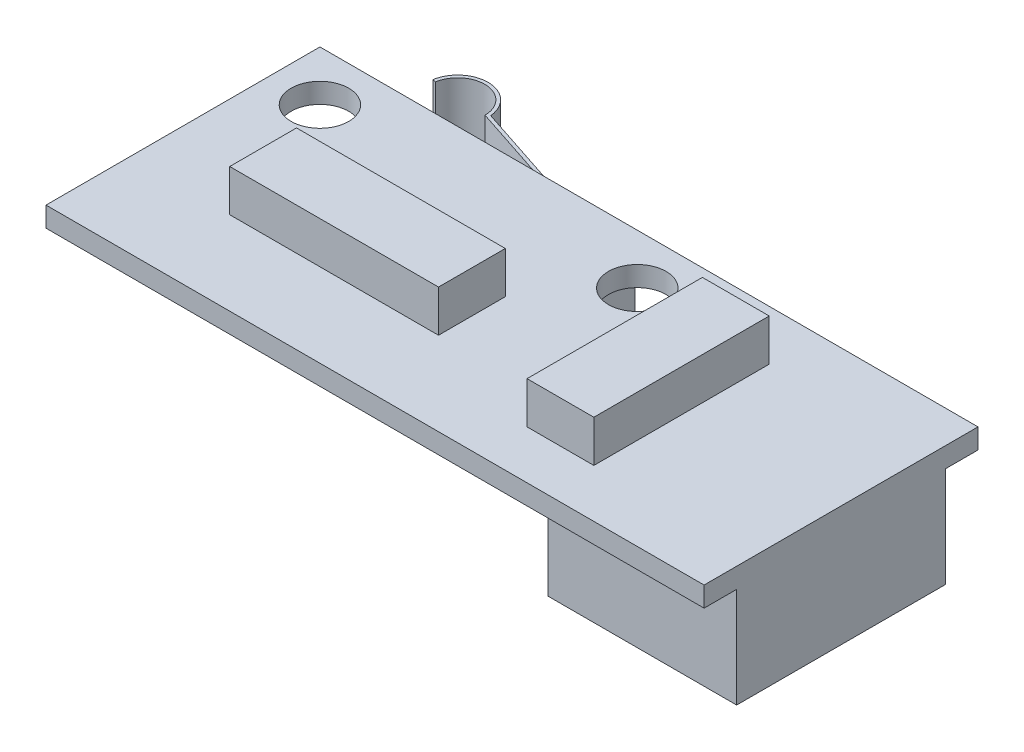
ISO-10303-21;
HEADER;
FILE_DESCRIPTION(('STEP AP214'),'2;1');
FILE_NAME('part.step','',(''),(''),'','','');
FILE_SCHEMA(('AUTOMOTIVE_DESIGN { 1 0 10303 214 1 1 1 1 }'));
ENDSEC;
DATA;
#1=APPLICATION_CONTEXT('core data for automotive mechanical design processes');
#2=APPLICATION_PROTOCOL_DEFINITION('international standard','automotive_design',2000,#1);
#3=PRODUCT_CONTEXT('',#1,'mechanical');
#4=PRODUCT('Part','Part','',(#3));
#5=PRODUCT_RELATED_PRODUCT_CATEGORY('part','',(#4));
#6=PRODUCT_DEFINITION_FORMATION('','',#4);
#7=PRODUCT_DEFINITION_CONTEXT('part definition',#1,'design');
#8=PRODUCT_DEFINITION('design','',#6,#7);
#9=PRODUCT_DEFINITION_SHAPE('','',#8);
#10=(LENGTH_UNIT() NAMED_UNIT(*) SI_UNIT(.MILLI.,.METRE.));
#11=(NAMED_UNIT(*) PLANE_ANGLE_UNIT() SI_UNIT($,.RADIAN.));
#12=(NAMED_UNIT(*) SI_UNIT($,.STERADIAN.) SOLID_ANGLE_UNIT());
#13=UNCERTAINTY_MEASURE_WITH_UNIT(LENGTH_MEASURE(1.E-05),#10,'distance_accuracy_value','');
#14=(GEOMETRIC_REPRESENTATION_CONTEXT(3) GLOBAL_UNCERTAINTY_ASSIGNED_CONTEXT((#13)) GLOBAL_UNIT_ASSIGNED_CONTEXT((#10,
#11,#12)) REPRESENTATION_CONTEXT('',''));
#15=CARTESIAN_POINT('',(0.,0.,0.));
#16=DIRECTION('',(0.,0.,1.));
#17=DIRECTION('',(1.,0.,0.));
#18=AXIS2_PLACEMENT_3D('',#15,#16,#17);
#19=CARTESIAN_POINT('',(19.7,1.2,-8.2));
#20=DIRECTION('',(0.,0.,1.));
#21=DIRECTION('',(1.,0.,0.));
#22=AXIS2_PLACEMENT_3D('',#19,#20,#21);
#23=PLANE('',#22);
#24=DIRECTION('',(-1.,0.,0.));
#25=VECTOR('',#24,1.);
#26=CARTESIAN_POINT('',(19.7,0.,-8.2));
#27=LINE('',#26,#25);
#28=CARTESIAN_POINT('',(19.7,0.,-8.2));
#29=VERTEX_POINT('',#28);
#30=CARTESIAN_POINT('',(-0.825000000000005,0.,-8.2));
#31=VERTEX_POINT('',#30);
#32=EDGE_CURVE('E361',#29,#31,#27,.T.);
#33=ORIENTED_EDGE('',*,*,#32,.T.);
#34=DIRECTION('',(0.,1.,0.));
#35=VECTOR('',#34,1.);
#36=CARTESIAN_POINT('',(-0.825000000000005,-6.,-8.2));
#37=LINE('',#36,#35);
#38=CARTESIAN_POINT('',(-0.825000000000005,-6.,-8.2));
#39=VERTEX_POINT('',#38);
#40=EDGE_CURVE('E252',#39,#31,#37,.T.);
#41=ORIENTED_EDGE('',*,*,#40,.F.);
#42=DIRECTION('',(1.,0.,0.));
#43=VECTOR('',#42,1.);
#44=CARTESIAN_POINT('',(-13.575,-6.,-8.2));
#45=LINE('',#44,#43);
#46=CARTESIAN_POINT('',(-13.575,-6.,-8.2));
#47=VERTEX_POINT('',#46);
#48=EDGE_CURVE('E238',#47,#39,#45,.T.);
#49=ORIENTED_EDGE('',*,*,#48,.F.);
#50=DIRECTION('',(0.,1.,0.));
#51=VECTOR('',#50,1.);
#52=CARTESIAN_POINT('',(-13.575,-6.,-8.2));
#53=LINE('',#52,#51);
#54=CARTESIAN_POINT('',(-13.575,0.,-8.2));
#55=VERTEX_POINT('',#54);
#56=EDGE_CURVE('E254',#47,#55,#53,.T.);
#57=ORIENTED_EDGE('',*,*,#56,.T.);
#58=CARTESIAN_POINT('',(-19.7,0.,-8.2));
#59=VERTEX_POINT('',#58);
#60=EDGE_CURVE('E376',#55,#59,#27,.T.);
#61=ORIENTED_EDGE('',*,*,#60,.T.);
#62=DIRECTION('',(0.,-1.,0.));
#63=VECTOR('',#62,1.);
#64=CARTESIAN_POINT('',(-19.7,1.2,-8.2));
#65=LINE('',#64,#63);
#66=CARTESIAN_POINT('',(-19.7,1.2,-8.2));
#67=VERTEX_POINT('',#66);
#68=EDGE_CURVE('E367',#67,#59,#65,.T.);
#69=ORIENTED_EDGE('',*,*,#68,.F.);
#70=DIRECTION('',(-1.,0.,0.));
#71=VECTOR('',#70,1.);
#72=CARTESIAN_POINT('',(19.7,1.2,-8.2));
#73=LINE('',#72,#71);
#74=CARTESIAN_POINT('',(19.7,1.2,-8.2));
#75=VERTEX_POINT('',#74);
#76=EDGE_CURVE('E365',#75,#67,#73,.T.);
#77=ORIENTED_EDGE('',*,*,#76,.F.);
#78=DIRECTION('',(0.,-1.,0.));
#79=VECTOR('',#78,1.);
#80=CARTESIAN_POINT('',(19.7,1.2,-8.2));
#81=LINE('',#80,#79);
#82=EDGE_CURVE('E381',#75,#29,#81,.T.);
#83=ORIENTED_EDGE('',*,*,#82,.T.);
#84=EDGE_LOOP('',(#33,#41,#49,#57,#61,#69,#77,#83));
#85=FACE_BOUND('',#84,.T.);
#86=DIRECTION('',(-1.,0.,0.));
#87=VECTOR('',#86,1.);
#88=CARTESIAN_POINT('',(-1.825,-5.,-8.2));
#89=LINE('',#88,#87);
#90=CARTESIAN_POINT('',(-1.825,-5.,-8.2));
#91=VERTEX_POINT('',#90);
#92=CARTESIAN_POINT('',(-2.465,-5.,-8.2));
#93=VERTEX_POINT('',#92);
#94=EDGE_CURVE('E214',#91,#93,#89,.T.);
#95=ORIENTED_EDGE('',*,*,#94,.F.);
#96=DIRECTION('',(0.,1.,0.));
#97=VECTOR('',#96,1.);
#98=CARTESIAN_POINT('',(-1.825,-5.,-8.2));
#99=LINE('',#98,#97);
#100=CARTESIAN_POINT('',(-1.825,-1.,-8.2));
#101=VERTEX_POINT('',#100);
#102=EDGE_CURVE('E627',#91,#101,#99,.T.);
#103=ORIENTED_EDGE('',*,*,#102,.T.);
#104=DIRECTION('',(-1.,0.,0.));
#105=VECTOR('',#104,1.);
#106=CARTESIAN_POINT('',(-1.825,-1.,-8.2));
#107=LINE('',#106,#105);
#108=CARTESIAN_POINT('',(-2.465,-1.,-8.2));
#109=VERTEX_POINT('',#108);
#110=EDGE_CURVE('E227',#101,#109,#107,.T.);
#111=ORIENTED_EDGE('',*,*,#110,.T.);
#112=DIRECTION('',(0.,1.,0.));
#113=VECTOR('',#112,1.);
#114=CARTESIAN_POINT('',(-2.465,-5.,-8.2));
#115=LINE('',#114,#113);
#116=EDGE_CURVE('E48',#93,#109,#115,.T.);
#117=ORIENTED_EDGE('',*,*,#116,.F.);
#118=EDGE_LOOP('',(#95,#103,#111,#117));
#119=FACE_BOUND('',#118,.T.);
#120=ADVANCED_FACE('F33',(#85,#119),#23,.F.);
#121=CARTESIAN_POINT('',(0.,0.,0.));
#122=DIRECTION('',(0.,1.,0.));
#123=DIRECTION('',(0.,0.,1.));
#124=AXIS2_PLACEMENT_3D('',#121,#122,#123);
#125=PLANE('',#124);
#126=CARTESIAN_POINT('',(-16.7,0.,-5.19999999999999));
#127=DIRECTION('',(0.,1.,0.));
#128=DIRECTION('',(0.,0.,1.));
#129=AXIS2_PLACEMENT_3D('',#126,#127,#128);
#130=CIRCLE('',#129,1.725);
#131=CARTESIAN_POINT('',(-16.7,0.,-3.47499999999999));
#132=VERTEX_POINT('',#131);
#133=EDGE_CURVE('E348',#132,#132,#130,.T.);
#134=ORIENTED_EDGE('',*,*,#133,.T.);
#135=EDGE_LOOP('',(#134));
#136=FACE_BOUND('',#135,.T.);
#137=CARTESIAN_POINT('',(2.29999999999999,0.,-5.19999999999999));
#138=DIRECTION('',(0.,1.,0.));
#139=DIRECTION('',(0.,0.,1.));
#140=AXIS2_PLACEMENT_3D('',#137,#138,#139);
#141=CIRCLE('',#140,1.725);
#142=CARTESIAN_POINT('',(2.29999999999999,0.,-3.47499999999999));
#143=VERTEX_POINT('',#142);
#144=EDGE_CURVE('E344',#143,#143,#141,.T.);
#145=ORIENTED_EDGE('',*,*,#144,.T.);
#146=EDGE_LOOP('',(#145));
#147=FACE_BOUND('',#146,.T.);
#148=DIRECTION('',(0.,0.,-1.));
#149=VECTOR('',#148,1.);
#150=CARTESIAN_POINT('',(-13.575,0.,-8.2));
#151=LINE('',#150,#149);
#152=CARTESIAN_POINT('',(-13.575,0.,-1.6));
#153=VERTEX_POINT('',#152);
#154=EDGE_CURVE('E56',#153,#55,#151,.T.);
#155=ORIENTED_EDGE('',*,*,#154,.F.);
#156=DIRECTION('',(-1.,0.,0.));
#157=VECTOR('',#156,1.);
#158=CARTESIAN_POINT('',(-13.575,0.,-1.6));
#159=LINE('',#158,#157);
#160=CARTESIAN_POINT('',(-0.825000000000004,0.,-1.6));
#161=VERTEX_POINT('',#160);
#162=EDGE_CURVE('E239',#161,#153,#159,.T.);
#163=ORIENTED_EDGE('',*,*,#162,.F.);
#164=DIRECTION('',(0.,0.,1.));
#165=VECTOR('',#164,1.);
#166=CARTESIAN_POINT('',(-0.825000000000005,0.,-8.2));
#167=LINE('',#166,#165);
#168=EDGE_CURVE('E229',#31,#161,#167,.T.);
#169=ORIENTED_EDGE('',*,*,#168,.F.);
#170=ORIENTED_EDGE('',*,*,#32,.F.);
#171=DIRECTION('',(0.,0.,-1.));
#172=VECTOR('',#171,1.);
#173=CARTESIAN_POINT('',(19.7,0.,8.2));
#174=LINE('',#173,#172);
#175=CARTESIAN_POINT('',(19.7,0.,-6.25));
#176=VERTEX_POINT('',#175);
#177=EDGE_CURVE('E372',#176,#29,#174,.T.);
#178=ORIENTED_EDGE('',*,*,#177,.F.);
#179=DIRECTION('',(1.,0.,0.));
#180=VECTOR('',#179,1.);
#181=CARTESIAN_POINT('',(19.7,0.,-6.25));
#182=LINE('',#181,#180);
#183=CARTESIAN_POINT('',(8.4,0.,-6.25));
#184=VERTEX_POINT('',#183);
#185=EDGE_CURVE('E261',#184,#176,#182,.T.);
#186=ORIENTED_EDGE('',*,*,#185,.F.);
#187=DIRECTION('',(0.,0.,-1.));
#188=VECTOR('',#187,1.);
#189=CARTESIAN_POINT('',(8.4,0.,6.25));
#190=LINE('',#189,#188);
#191=CARTESIAN_POINT('',(8.4,0.,6.25));
#192=VERTEX_POINT('',#191);
#193=EDGE_CURVE('E270',#192,#184,#190,.T.);
#194=ORIENTED_EDGE('',*,*,#193,.F.);
#195=DIRECTION('',(-1.,0.,0.));
#196=VECTOR('',#195,1.);
#197=CARTESIAN_POINT('',(19.7,0.,6.25));
#198=LINE('',#197,#196);
#199=CARTESIAN_POINT('',(19.7,0.,6.25));
#200=VERTEX_POINT('',#199);
#201=EDGE_CURVE('E256',#200,#192,#198,.T.);
#202=ORIENTED_EDGE('',*,*,#201,.F.);
#203=CARTESIAN_POINT('',(19.7,0.,8.2));
#204=VERTEX_POINT('',#203);
#205=EDGE_CURVE('E373',#204,#200,#174,.T.);
#206=ORIENTED_EDGE('',*,*,#205,.F.);
#207=DIRECTION('',(1.,0.,0.));
#208=VECTOR('',#207,1.);
#209=CARTESIAN_POINT('',(19.7,0.,8.2));
#210=LINE('',#209,#208);
#211=CARTESIAN_POINT('',(-19.7,0.,8.2));
#212=VERTEX_POINT('',#211);
#213=EDGE_CURVE('E370',#212,#204,#210,.T.);
#214=ORIENTED_EDGE('',*,*,#213,.F.);
#215=DIRECTION('',(0.,0.,1.));
#216=VECTOR('',#215,1.);
#217=CARTESIAN_POINT('',(-19.7,0.,8.2));
#218=LINE('',#217,#216);
#219=EDGE_CURVE('E354',#59,#212,#218,.T.);
#220=ORIENTED_EDGE('',*,*,#219,.F.);
#221=ORIENTED_EDGE('',*,*,#60,.F.);
#222=EDGE_LOOP('',(#155,#163,#169,#170,#178,#186,#194,#202,#206,#214,#220,#221));
#223=FACE_BOUND('',#222,.T.);
#224=ADVANCED_FACE('F393',(#136,#147,#223),#125,.F.);
#225=CARTESIAN_POINT('',(0.,1.2,0.));
#226=DIRECTION('',(0.,1.,0.));
#227=DIRECTION('',(0.,0.,1.));
#228=AXIS2_PLACEMENT_3D('',#225,#226,#227);
#229=PLANE('',#228);
#230=CARTESIAN_POINT('',(-16.7,1.2,-5.19999999999999));
#231=DIRECTION('',(0.,1.,0.));
#232=DIRECTION('',(0.,0.,1.));
#233=AXIS2_PLACEMENT_3D('',#230,#231,#232);
#234=CIRCLE('',#233,1.725);
#235=CARTESIAN_POINT('',(-16.7,1.2,-3.47499999999999));
#236=VERTEX_POINT('',#235);
#237=EDGE_CURVE('E351',#236,#236,#234,.T.);
#238=ORIENTED_EDGE('',*,*,#237,.F.);
#239=EDGE_LOOP('',(#238));
#240=FACE_BOUND('',#239,.T.);
#241=DIRECTION('',(0.,0.,1.));
#242=VECTOR('',#241,1.);
#243=CARTESIAN_POINT('',(-19.7,1.2,8.2));
#244=LINE('',#243,#242);
#245=CARTESIAN_POINT('',(-19.7,1.2,8.2));
#246=VERTEX_POINT('',#245);
#247=EDGE_CURVE('E357',#67,#246,#244,.T.);
#248=ORIENTED_EDGE('',*,*,#247,.T.);
#249=DIRECTION('',(1.,0.,0.));
#250=VECTOR('',#249,1.);
#251=CARTESIAN_POINT('',(19.7,1.2,8.2));
#252=LINE('',#251,#250);
#253=CARTESIAN_POINT('',(19.7,1.2,8.2));
#254=VERTEX_POINT('',#253);
#255=EDGE_CURVE('E360',#246,#254,#252,.T.);
#256=ORIENTED_EDGE('',*,*,#255,.T.);
#257=DIRECTION('',(0.,0.,-1.));
#258=VECTOR('',#257,1.);
#259=CARTESIAN_POINT('',(19.7,1.2,8.2));
#260=LINE('',#259,#258);
#261=EDGE_CURVE('E363',#254,#75,#260,.T.);
#262=ORIENTED_EDGE('',*,*,#261,.T.);
#263=ORIENTED_EDGE('',*,*,#76,.T.);
#264=EDGE_LOOP('',(#248,#256,#262,#263));
#265=FACE_BOUND('',#264,.T.);
#266=CARTESIAN_POINT('',(2.29999999999999,1.2,-5.19999999999999));
#267=DIRECTION('',(0.,1.,0.));
#268=DIRECTION('',(0.,0.,1.));
#269=AXIS2_PLACEMENT_3D('',#266,#267,#268);
#270=CIRCLE('',#269,1.725);
#271=CARTESIAN_POINT('',(2.29999999999999,1.2,-3.47499999999999));
#272=VERTEX_POINT('',#271);
#273=EDGE_CURVE('E345',#272,#272,#270,.T.);
#274=ORIENTED_EDGE('',*,*,#273,.F.);
#275=EDGE_LOOP('',(#274));
#276=FACE_BOUND('',#275,.T.);
#277=DIRECTION('',(1.,0.,0.));
#278=VECTOR('',#277,1.);
#279=CARTESIAN_POINT('',(-13.7,1.2,3.2));
#280=LINE('',#279,#278);
#281=CARTESIAN_POINT('',(-13.7,1.2,3.2));
#282=VERTEX_POINT('',#281);
#283=CARTESIAN_POINT('',(-1.2,1.2,3.2));
#284=VERTEX_POINT('',#283);
#285=EDGE_CURVE('E329',#282,#284,#280,.T.);
#286=ORIENTED_EDGE('',*,*,#285,.F.);
#287=DIRECTION('',(0.,0.,1.));
#288=VECTOR('',#287,1.);
#289=CARTESIAN_POINT('',(-13.7,1.2,-0.800000000000001));
#290=LINE('',#289,#288);
#291=CARTESIAN_POINT('',(-13.7,1.2,-0.800000000000001));
#292=VERTEX_POINT('',#291);
#293=EDGE_CURVE('E315',#292,#282,#290,.T.);
#294=ORIENTED_EDGE('',*,*,#293,.F.);
#295=DIRECTION('',(-1.,0.,0.));
#296=VECTOR('',#295,1.);
#297=CARTESIAN_POINT('',(-13.7,1.2,-0.800000000000001));
#298=LINE('',#297,#296);
#299=CARTESIAN_POINT('',(-1.2,1.2,-0.800000000000001));
#300=VERTEX_POINT('',#299);
#301=EDGE_CURVE('E320',#300,#292,#298,.T.);
#302=ORIENTED_EDGE('',*,*,#301,.F.);
#303=DIRECTION('',(0.,0.,-1.));
#304=VECTOR('',#303,1.);
#305=CARTESIAN_POINT('',(-1.2,1.2,-0.800000000000001));
#306=LINE('',#305,#304);
#307=EDGE_CURVE('E331',#284,#300,#306,.T.);
#308=ORIENTED_EDGE('',*,*,#307,.F.);
#309=EDGE_LOOP('',(#286,#294,#302,#308));
#310=FACE_BOUND('',#309,.T.);
#311=DIRECTION('',(1.,0.,0.));
#312=VECTOR('',#311,1.);
#313=CARTESIAN_POINT('',(6.2,1.2,5.3));
#314=LINE('',#313,#312);
#315=CARTESIAN_POINT('',(6.2,1.2,5.3));
#316=VERTEX_POINT('',#315);
#317=CARTESIAN_POINT('',(10.2,1.2,5.3));
#318=VERTEX_POINT('',#317);
#319=EDGE_CURVE('E300',#316,#318,#314,.T.);
#320=ORIENTED_EDGE('',*,*,#319,.F.);
#321=DIRECTION('',(0.,0.,1.));
#322=VECTOR('',#321,1.);
#323=CARTESIAN_POINT('',(6.2,1.2,-5.2));
#324=LINE('',#323,#322);
#325=CARTESIAN_POINT('',(6.2,1.2,-5.2));
#326=VERTEX_POINT('',#325);
#327=EDGE_CURVE('E286',#326,#316,#324,.T.);
#328=ORIENTED_EDGE('',*,*,#327,.F.);
#329=DIRECTION('',(-1.,0.,0.));
#330=VECTOR('',#329,1.);
#331=CARTESIAN_POINT('',(6.2,1.2,-5.2));
#332=LINE('',#331,#330);
#333=CARTESIAN_POINT('',(10.2,1.2,-5.2));
#334=VERTEX_POINT('',#333);
#335=EDGE_CURVE('E291',#334,#326,#332,.T.);
#336=ORIENTED_EDGE('',*,*,#335,.F.);
#337=DIRECTION('',(0.,0.,-1.));
#338=VECTOR('',#337,1.);
#339=CARTESIAN_POINT('',(10.2,1.2,-5.2));
#340=LINE('',#339,#338);
#341=EDGE_CURVE('E302',#318,#334,#340,.T.);
#342=ORIENTED_EDGE('',*,*,#341,.F.);
#343=EDGE_LOOP('',(#320,#328,#336,#342));
#344=FACE_BOUND('',#343,.T.);
#345=ADVANCED_FACE('F419',(#240,#265,#276,#310,#344),#229,.T.);
#346=CARTESIAN_POINT('',(-19.7,1.2,8.2));
#347=DIRECTION('',(1.,0.,0.));
#348=DIRECTION('',(0.,0.,-1.));
#349=AXIS2_PLACEMENT_3D('',#346,#347,#348);
#350=PLANE('',#349);
#351=ORIENTED_EDGE('',*,*,#219,.T.);
#352=DIRECTION('',(0.,-1.,0.));
#353=VECTOR('',#352,1.);
#354=CARTESIAN_POINT('',(-19.7,1.2,8.2));
#355=LINE('',#354,#353);
#356=EDGE_CURVE('E11',#246,#212,#355,.T.);
#357=ORIENTED_EDGE('',*,*,#356,.F.);
#358=ORIENTED_EDGE('',*,*,#247,.F.);
#359=ORIENTED_EDGE('',*,*,#68,.T.);
#360=EDGE_LOOP('',(#351,#357,#358,#359));
#361=FACE_BOUND('',#360,.T.);
#362=ADVANCED_FACE('F35',(#361),#350,.F.);
#363=CARTESIAN_POINT('',(19.7,1.2,8.2));
#364=DIRECTION('',(0.,0.,-1.));
#365=DIRECTION('',(-1.,0.,0.));
#366=AXIS2_PLACEMENT_3D('',#363,#364,#365);
#367=PLANE('',#366);
#368=ORIENTED_EDGE('',*,*,#213,.T.);
#369=DIRECTION('',(0.,-1.,0.));
#370=VECTOR('',#369,1.);
#371=CARTESIAN_POINT('',(19.7,1.2,8.2));
#372=LINE('',#371,#370);
#373=EDGE_CURVE('E41',#254,#204,#372,.T.);
#374=ORIENTED_EDGE('',*,*,#373,.F.);
#375=ORIENTED_EDGE('',*,*,#255,.F.);
#376=ORIENTED_EDGE('',*,*,#356,.T.);
#377=EDGE_LOOP('',(#368,#374,#375,#376));
#378=FACE_BOUND('',#377,.T.);
#379=ADVANCED_FACE('F422',(#378),#367,.F.);
#380=CARTESIAN_POINT('',(19.7,1.2,8.2));
#381=DIRECTION('',(-1.,0.,0.));
#382=DIRECTION('',(0.,0.,1.));
#383=AXIS2_PLACEMENT_3D('',#380,#381,#382);
#384=PLANE('',#383);
#385=ORIENTED_EDGE('',*,*,#205,.T.);
#386=DIRECTION('',(0.,1.,0.));
#387=VECTOR('',#386,1.);
#388=CARTESIAN_POINT('',(19.7,-6.,6.25));
#389=LINE('',#388,#387);
#390=CARTESIAN_POINT('',(19.7,-6.,6.25));
#391=VERTEX_POINT('',#390);
#392=EDGE_CURVE('E283',#391,#200,#389,.T.);
#393=ORIENTED_EDGE('',*,*,#392,.F.);
#394=DIRECTION('',(0.,0.,1.));
#395=VECTOR('',#394,1.);
#396=CARTESIAN_POINT('',(19.7,-6.,6.25));
#397=LINE('',#396,#395);
#398=CARTESIAN_POINT('',(19.7,-6.,-6.25));
#399=VERTEX_POINT('',#398);
#400=EDGE_CURVE('E257',#399,#391,#397,.T.);
#401=ORIENTED_EDGE('',*,*,#400,.F.);
#402=DIRECTION('',(0.,1.,0.));
#403=VECTOR('',#402,1.);
#404=CARTESIAN_POINT('',(19.7,-6.,-6.25));
#405=LINE('',#404,#403);
#406=EDGE_CURVE('E267',#399,#176,#405,.T.);
#407=ORIENTED_EDGE('',*,*,#406,.T.);
#408=ORIENTED_EDGE('',*,*,#177,.T.);
#409=ORIENTED_EDGE('',*,*,#82,.F.);
#410=ORIENTED_EDGE('',*,*,#261,.F.);
#411=ORIENTED_EDGE('',*,*,#373,.T.);
#412=EDGE_LOOP('',(#385,#393,#401,#407,#408,#409,#410,#411));
#413=FACE_BOUND('',#412,.T.);
#414=ADVANCED_FACE('F388',(#413),#384,.F.);
#415=CARTESIAN_POINT('',(-16.7,1.2,-5.19999999999999));
#416=DIRECTION('',(0.,-1.,0.));
#417=DIRECTION('',(0.,0.,-1.));
#418=AXIS2_PLACEMENT_3D('',#415,#416,#417);
#419=CYLINDRICAL_SURFACE('',#418,1.725);
#420=ORIENTED_EDGE('',*,*,#237,.T.);
#421=EDGE_LOOP('',(#420));
#422=FACE_BOUND('',#421,.T.);
#423=ORIENTED_EDGE('',*,*,#133,.F.);
#424=EDGE_LOOP('',(#423));
#425=FACE_BOUND('',#424,.T.);
#426=ADVANCED_FACE('F454',(#422,#425),#419,.F.);
#427=CARTESIAN_POINT('',(2.29999999999999,1.2,-5.19999999999999));
#428=DIRECTION('',(0.,-1.,0.));
#429=DIRECTION('',(0.,0.,-1.));
#430=AXIS2_PLACEMENT_3D('',#427,#428,#429);
#431=CYLINDRICAL_SURFACE('',#430,1.725);
#432=ORIENTED_EDGE('',*,*,#273,.T.);
#433=EDGE_LOOP('',(#432));
#434=FACE_BOUND('',#433,.T.);
#435=ORIENTED_EDGE('',*,*,#144,.F.);
#436=EDGE_LOOP('',(#435));
#437=FACE_BOUND('',#436,.T.);
#438=ADVANCED_FACE('F469',(#434,#437),#431,.F.);
#439=CARTESIAN_POINT('',(-13.7,3.7,-0.800000000000001));
#440=DIRECTION('',(1.,0.,0.));
#441=DIRECTION('',(0.,0.,-1.));
#442=AXIS2_PLACEMENT_3D('',#439,#440,#441);
#443=PLANE('',#442);
#444=ORIENTED_EDGE('',*,*,#293,.T.);
#445=DIRECTION('',(0.,-1.,0.));
#446=VECTOR('',#445,1.);
#447=CARTESIAN_POINT('',(-13.7,3.7,3.2));
#448=LINE('',#447,#446);
#449=CARTESIAN_POINT('',(-13.7,3.7,3.2));
#450=VERTEX_POINT('',#449);
#451=EDGE_CURVE('E342',#450,#282,#448,.T.);
#452=ORIENTED_EDGE('',*,*,#451,.F.);
#453=DIRECTION('',(0.,0.,1.));
#454=VECTOR('',#453,1.);
#455=CARTESIAN_POINT('',(-13.7,3.7,-0.800000000000001));
#456=LINE('',#455,#454);
#457=CARTESIAN_POINT('',(-13.7,3.7,-0.800000000000001));
#458=VERTEX_POINT('',#457);
#459=EDGE_CURVE('E316',#458,#450,#456,.T.);
#460=ORIENTED_EDGE('',*,*,#459,.F.);
#461=DIRECTION('',(0.,-1.,0.));
#462=VECTOR('',#461,1.);
#463=CARTESIAN_POINT('',(-13.7,3.7,-0.800000000000001));
#464=LINE('',#463,#462);
#465=EDGE_CURVE('E326',#458,#292,#464,.T.);
#466=ORIENTED_EDGE('',*,*,#465,.T.);
#467=EDGE_LOOP('',(#444,#452,#460,#466));
#468=FACE_BOUND('',#467,.T.);
#469=ADVANCED_FACE('F473',(#468),#443,.F.);
#470=CARTESIAN_POINT('',(-13.7,3.7,3.2));
#471=DIRECTION('',(0.,0.,-1.));
#472=DIRECTION('',(-1.,0.,0.));
#473=AXIS2_PLACEMENT_3D('',#470,#471,#472);
#474=PLANE('',#473);
#475=ORIENTED_EDGE('',*,*,#285,.T.);
#476=DIRECTION('',(0.,-1.,0.));
#477=VECTOR('',#476,1.);
#478=CARTESIAN_POINT('',(-1.2,3.7,3.2));
#479=LINE('',#478,#477);
#480=CARTESIAN_POINT('',(-1.2,3.7,3.2));
#481=VERTEX_POINT('',#480);
#482=EDGE_CURVE('E339',#481,#284,#479,.T.);
#483=ORIENTED_EDGE('',*,*,#482,.F.);
#484=DIRECTION('',(1.,0.,0.));
#485=VECTOR('',#484,1.);
#486=CARTESIAN_POINT('',(-13.7,3.7,3.2));
#487=LINE('',#486,#485);
#488=EDGE_CURVE('E319',#450,#481,#487,.T.);
#489=ORIENTED_EDGE('',*,*,#488,.F.);
#490=ORIENTED_EDGE('',*,*,#451,.T.);
#491=EDGE_LOOP('',(#475,#483,#489,#490));
#492=FACE_BOUND('',#491,.T.);
#493=ADVANCED_FACE('F477',(#492),#474,.F.);
#494=CARTESIAN_POINT('',(-1.2,3.7,-0.800000000000001));
#495=DIRECTION('',(-1.,0.,0.));
#496=DIRECTION('',(0.,0.,1.));
#497=AXIS2_PLACEMENT_3D('',#494,#495,#496);
#498=PLANE('',#497);
#499=ORIENTED_EDGE('',*,*,#307,.T.);
#500=DIRECTION('',(0.,-1.,0.));
#501=VECTOR('',#500,1.);
#502=CARTESIAN_POINT('',(-1.2,3.7,-0.800000000000001));
#503=LINE('',#502,#501);
#504=CARTESIAN_POINT('',(-1.2,3.7,-0.800000000000001));
#505=VERTEX_POINT('',#504);
#506=EDGE_CURVE('E337',#505,#300,#503,.T.);
#507=ORIENTED_EDGE('',*,*,#506,.F.);
#508=DIRECTION('',(0.,0.,-1.));
#509=VECTOR('',#508,1.);
#510=CARTESIAN_POINT('',(-1.2,3.7,-0.800000000000001));
#511=LINE('',#510,#509);
#512=EDGE_CURVE('E322',#481,#505,#511,.T.);
#513=ORIENTED_EDGE('',*,*,#512,.F.);
#514=ORIENTED_EDGE('',*,*,#482,.T.);
#515=EDGE_LOOP('',(#499,#507,#513,#514));
#516=FACE_BOUND('',#515,.T.);
#517=ADVANCED_FACE('F481',(#516),#498,.F.);
#518=CARTESIAN_POINT('',(-13.7,3.7,-0.800000000000001));
#519=DIRECTION('',(0.,0.,1.));
#520=DIRECTION('',(1.,0.,0.));
#521=AXIS2_PLACEMENT_3D('',#518,#519,#520);
#522=PLANE('',#521);
#523=ORIENTED_EDGE('',*,*,#301,.T.);
#524=ORIENTED_EDGE('',*,*,#465,.F.);
#525=DIRECTION('',(-1.,0.,0.));
#526=VECTOR('',#525,1.);
#527=CARTESIAN_POINT('',(-13.7,3.7,-0.800000000000001));
#528=LINE('',#527,#526);
#529=EDGE_CURVE('E324',#505,#458,#528,.T.);
#530=ORIENTED_EDGE('',*,*,#529,.F.);
#531=ORIENTED_EDGE('',*,*,#506,.T.);
#532=EDGE_LOOP('',(#523,#524,#530,#531));
#533=FACE_BOUND('',#532,.T.);
#534=ADVANCED_FACE('F485',(#533),#522,.F.);
#535=CARTESIAN_POINT('',(0.,3.7,0.));
#536=DIRECTION('',(0.,1.,0.));
#537=DIRECTION('',(0.,0.,1.));
#538=AXIS2_PLACEMENT_3D('',#535,#536,#537);
#539=PLANE('',#538);
#540=ORIENTED_EDGE('',*,*,#459,.T.);
#541=ORIENTED_EDGE('',*,*,#488,.T.);
#542=ORIENTED_EDGE('',*,*,#512,.T.);
#543=ORIENTED_EDGE('',*,*,#529,.T.);
#544=EDGE_LOOP('',(#540,#541,#542,#543));
#545=FACE_BOUND('',#544,.T.);
#546=ADVANCED_FACE('F489',(#545),#539,.T.);
#547=CARTESIAN_POINT('',(6.2,3.7,-5.2));
#548=DIRECTION('',(1.,0.,0.));
#549=DIRECTION('',(0.,0.,-1.));
#550=AXIS2_PLACEMENT_3D('',#547,#548,#549);
#551=PLANE('',#550);
#552=ORIENTED_EDGE('',*,*,#327,.T.);
#553=DIRECTION('',(0.,-1.,0.));
#554=VECTOR('',#553,1.);
#555=CARTESIAN_POINT('',(6.2,3.7,5.3));
#556=LINE('',#555,#554);
#557=CARTESIAN_POINT('',(6.2,3.7,5.3));
#558=VERTEX_POINT('',#557);
#559=EDGE_CURVE('E313',#558,#316,#556,.T.);
#560=ORIENTED_EDGE('',*,*,#559,.F.);
#561=DIRECTION('',(0.,0.,1.));
#562=VECTOR('',#561,1.);
#563=CARTESIAN_POINT('',(6.2,3.7,-5.2));
#564=LINE('',#563,#562);
#565=CARTESIAN_POINT('',(6.2,3.7,-5.2));
#566=VERTEX_POINT('',#565);
#567=EDGE_CURVE('E287',#566,#558,#564,.T.);
#568=ORIENTED_EDGE('',*,*,#567,.F.);
#569=DIRECTION('',(0.,-1.,0.));
#570=VECTOR('',#569,1.);
#571=CARTESIAN_POINT('',(6.2,3.7,-5.2));
#572=LINE('',#571,#570);
#573=EDGE_CURVE('E297',#566,#326,#572,.T.);
#574=ORIENTED_EDGE('',*,*,#573,.T.);
#575=EDGE_LOOP('',(#552,#560,#568,#574));
#576=FACE_BOUND('',#575,.T.);
#577=ADVANCED_FACE('F493',(#576),#551,.F.);
#578=CARTESIAN_POINT('',(6.2,3.7,5.3));
#579=DIRECTION('',(0.,0.,-1.));
#580=DIRECTION('',(-1.,0.,0.));
#581=AXIS2_PLACEMENT_3D('',#578,#579,#580);
#582=PLANE('',#581);
#583=ORIENTED_EDGE('',*,*,#319,.T.);
#584=DIRECTION('',(0.,-1.,0.));
#585=VECTOR('',#584,1.);
#586=CARTESIAN_POINT('',(10.2,3.7,5.3));
#587=LINE('',#586,#585);
#588=CARTESIAN_POINT('',(10.2,3.7,5.3));
#589=VERTEX_POINT('',#588);
#590=EDGE_CURVE('E310',#589,#318,#587,.T.);
#591=ORIENTED_EDGE('',*,*,#590,.F.);
#592=DIRECTION('',(1.,0.,0.));
#593=VECTOR('',#592,1.);
#594=CARTESIAN_POINT('',(6.2,3.7,5.3));
#595=LINE('',#594,#593);
#596=EDGE_CURVE('E290',#558,#589,#595,.T.);
#597=ORIENTED_EDGE('',*,*,#596,.F.);
#598=ORIENTED_EDGE('',*,*,#559,.T.);
#599=EDGE_LOOP('',(#583,#591,#597,#598));
#600=FACE_BOUND('',#599,.T.);
#601=ADVANCED_FACE('F497',(#600),#582,.F.);
#602=CARTESIAN_POINT('',(10.2,3.7,-5.2));
#603=DIRECTION('',(-1.,0.,0.));
#604=DIRECTION('',(0.,0.,1.));
#605=AXIS2_PLACEMENT_3D('',#602,#603,#604);
#606=PLANE('',#605);
#607=ORIENTED_EDGE('',*,*,#341,.T.);
#608=DIRECTION('',(0.,-1.,0.));
#609=VECTOR('',#608,1.);
#610=CARTESIAN_POINT('',(10.2,3.7,-5.2));
#611=LINE('',#610,#609);
#612=CARTESIAN_POINT('',(10.2,3.7,-5.2));
#613=VERTEX_POINT('',#612);
#614=EDGE_CURVE('E308',#613,#334,#611,.T.);
#615=ORIENTED_EDGE('',*,*,#614,.F.);
#616=DIRECTION('',(0.,0.,-1.));
#617=VECTOR('',#616,1.);
#618=CARTESIAN_POINT('',(10.2,3.7,-5.2));
#619=LINE('',#618,#617);
#620=EDGE_CURVE('E293',#589,#613,#619,.T.);
#621=ORIENTED_EDGE('',*,*,#620,.F.);
#622=ORIENTED_EDGE('',*,*,#590,.T.);
#623=EDGE_LOOP('',(#607,#615,#621,#622));
#624=FACE_BOUND('',#623,.T.);
#625=ADVANCED_FACE('F501',(#624),#606,.F.);
#626=CARTESIAN_POINT('',(6.2,3.7,-5.2));
#627=DIRECTION('',(0.,0.,1.));
#628=DIRECTION('',(1.,0.,0.));
#629=AXIS2_PLACEMENT_3D('',#626,#627,#628);
#630=PLANE('',#629);
#631=ORIENTED_EDGE('',*,*,#335,.T.);
#632=ORIENTED_EDGE('',*,*,#573,.F.);
#633=DIRECTION('',(-1.,0.,0.));
#634=VECTOR('',#633,1.);
#635=CARTESIAN_POINT('',(6.2,3.7,-5.2));
#636=LINE('',#635,#634);
#637=EDGE_CURVE('E295',#613,#566,#636,.T.);
#638=ORIENTED_EDGE('',*,*,#637,.F.);
#639=ORIENTED_EDGE('',*,*,#614,.T.);
#640=EDGE_LOOP('',(#631,#632,#638,#639));
#641=FACE_BOUND('',#640,.T.);
#642=ADVANCED_FACE('F505',(#641),#630,.F.);
#643=CARTESIAN_POINT('',(0.,3.7,0.));
#644=DIRECTION('',(0.,1.,0.));
#645=DIRECTION('',(0.,0.,1.));
#646=AXIS2_PLACEMENT_3D('',#643,#644,#645);
#647=PLANE('',#646);
#648=ORIENTED_EDGE('',*,*,#567,.T.);
#649=ORIENTED_EDGE('',*,*,#596,.T.);
#650=ORIENTED_EDGE('',*,*,#620,.T.);
#651=ORIENTED_EDGE('',*,*,#637,.T.);
#652=EDGE_LOOP('',(#648,#649,#650,#651));
#653=FACE_BOUND('',#652,.T.);
#654=ADVANCED_FACE('F509',(#653),#647,.T.);
#655=CARTESIAN_POINT('',(19.7,-6.,6.25));
#656=DIRECTION('',(0.,0.,-1.));
#657=DIRECTION('',(-1.,0.,0.));
#658=AXIS2_PLACEMENT_3D('',#655,#656,#657);
#659=PLANE('',#658);
#660=ORIENTED_EDGE('',*,*,#201,.T.);
#661=DIRECTION('',(0.,1.,0.));
#662=VECTOR('',#661,1.);
#663=CARTESIAN_POINT('',(8.4,-6.,6.25));
#664=LINE('',#663,#662);
#665=CARTESIAN_POINT('',(8.4,-6.,6.25));
#666=VERTEX_POINT('',#665);
#667=EDGE_CURVE('E280',#666,#192,#664,.T.);
#668=ORIENTED_EDGE('',*,*,#667,.F.);
#669=DIRECTION('',(-1.,0.,0.));
#670=VECTOR('',#669,1.);
#671=CARTESIAN_POINT('',(19.7,-6.,6.25));
#672=LINE('',#671,#670);
#673=EDGE_CURVE('E260',#391,#666,#672,.T.);
#674=ORIENTED_EDGE('',*,*,#673,.F.);
#675=ORIENTED_EDGE('',*,*,#392,.T.);
#676=EDGE_LOOP('',(#660,#668,#674,#675));
#677=FACE_BOUND('',#676,.T.);
#678=ADVANCED_FACE('F397',(#677),#659,.F.);
#679=CARTESIAN_POINT('',(8.4,-6.,6.25));
#680=DIRECTION('',(1.,0.,0.));
#681=DIRECTION('',(0.,0.,-1.));
#682=AXIS2_PLACEMENT_3D('',#679,#680,#681);
#683=PLANE('',#682);
#684=ORIENTED_EDGE('',*,*,#193,.T.);
#685=DIRECTION('',(0.,1.,0.));
#686=VECTOR('',#685,1.);
#687=CARTESIAN_POINT('',(8.4,-6.,-6.25));
#688=LINE('',#687,#686);
#689=CARTESIAN_POINT('',(8.4,-6.,-6.25));
#690=VERTEX_POINT('',#689);
#691=EDGE_CURVE('E277',#690,#184,#688,.T.);
#692=ORIENTED_EDGE('',*,*,#691,.F.);
#693=DIRECTION('',(0.,0.,-1.));
#694=VECTOR('',#693,1.);
#695=CARTESIAN_POINT('',(8.4,-6.,6.25));
#696=LINE('',#695,#694);
#697=EDGE_CURVE('E263',#666,#690,#696,.T.);
#698=ORIENTED_EDGE('',*,*,#697,.F.);
#699=ORIENTED_EDGE('',*,*,#667,.T.);
#700=EDGE_LOOP('',(#684,#692,#698,#699));
#701=FACE_BOUND('',#700,.T.);
#702=ADVANCED_FACE('F400',(#701),#683,.F.);
#703=CARTESIAN_POINT('',(19.7,-6.,-6.25));
#704=DIRECTION('',(0.,0.,1.));
#705=DIRECTION('',(1.,0.,0.));
#706=AXIS2_PLACEMENT_3D('',#703,#704,#705);
#707=PLANE('',#706);
#708=ORIENTED_EDGE('',*,*,#185,.T.);
#709=ORIENTED_EDGE('',*,*,#406,.F.);
#710=DIRECTION('',(1.,0.,0.));
#711=VECTOR('',#710,1.);
#712=CARTESIAN_POINT('',(19.7,-6.,-6.25));
#713=LINE('',#712,#711);
#714=EDGE_CURVE('E265',#690,#399,#713,.T.);
#715=ORIENTED_EDGE('',*,*,#714,.F.);
#716=ORIENTED_EDGE('',*,*,#691,.T.);
#717=EDGE_LOOP('',(#708,#709,#715,#716));
#718=FACE_BOUND('',#717,.T.);
#719=ADVANCED_FACE('F408',(#718),#707,.F.);
#720=CARTESIAN_POINT('',(0.,-6.,0.));
#721=DIRECTION('',(0.,1.,0.));
#722=DIRECTION('',(0.,0.,1.));
#723=AXIS2_PLACEMENT_3D('',#720,#721,#722);
#724=PLANE('',#723);
#725=ORIENTED_EDGE('',*,*,#400,.T.);
#726=ORIENTED_EDGE('',*,*,#673,.T.);
#727=ORIENTED_EDGE('',*,*,#697,.T.);
#728=ORIENTED_EDGE('',*,*,#714,.T.);
#729=EDGE_LOOP('',(#725,#726,#727,#728));
#730=FACE_BOUND('',#729,.T.);
#731=ADVANCED_FACE('F404',(#730),#724,.F.);
#732=CARTESIAN_POINT('',(-13.575,-6.,-8.2));
#733=DIRECTION('',(1.,0.,0.));
#734=DIRECTION('',(0.,0.,-1.));
#735=AXIS2_PLACEMENT_3D('',#732,#733,#734);
#736=PLANE('',#735);
#737=ORIENTED_EDGE('',*,*,#154,.T.);
#738=ORIENTED_EDGE('',*,*,#56,.F.);
#739=DIRECTION('',(0.,0.,-1.));
#740=VECTOR('',#739,1.);
#741=CARTESIAN_POINT('',(-13.575,-6.,-8.2));
#742=LINE('',#741,#740);
#743=CARTESIAN_POINT('',(-13.575,-6.,-1.6));
#744=VERTEX_POINT('',#743);
#745=EDGE_CURVE('E235',#744,#47,#742,.T.);
#746=ORIENTED_EDGE('',*,*,#745,.F.);
#747=DIRECTION('',(0.,1.,0.));
#748=VECTOR('',#747,1.);
#749=CARTESIAN_POINT('',(-13.575,-6.,-1.6));
#750=LINE('',#749,#748);
#751=EDGE_CURVE('E244',#744,#153,#750,.T.);
#752=ORIENTED_EDGE('',*,*,#751,.T.);
#753=EDGE_LOOP('',(#737,#738,#746,#752));
#754=FACE_BOUND('',#753,.T.);
#755=ADVANCED_FACE('F426',(#754),#736,.F.);
#756=CARTESIAN_POINT('',(-0.825000000000005,-6.,-8.2));
#757=DIRECTION('',(-1.,0.,0.));
#758=DIRECTION('',(0.,0.,1.));
#759=AXIS2_PLACEMENT_3D('',#756,#757,#758);
#760=PLANE('',#759);
#761=ORIENTED_EDGE('',*,*,#168,.T.);
#762=DIRECTION('',(0.,1.,0.));
#763=VECTOR('',#762,1.);
#764=CARTESIAN_POINT('',(-0.825000000000004,-6.,-1.6));
#765=LINE('',#764,#763);
#766=CARTESIAN_POINT('',(-0.825000000000004,-6.,-1.6));
#767=VERTEX_POINT('',#766);
#768=EDGE_CURVE('E249',#767,#161,#765,.T.);
#769=ORIENTED_EDGE('',*,*,#768,.F.);
#770=DIRECTION('',(0.,0.,1.));
#771=VECTOR('',#770,1.);
#772=CARTESIAN_POINT('',(-0.825000000000005,-6.,-8.2));
#773=LINE('',#772,#771);
#774=EDGE_CURVE('E241',#39,#767,#773,.T.);
#775=ORIENTED_EDGE('',*,*,#774,.F.);
#776=ORIENTED_EDGE('',*,*,#40,.T.);
#777=EDGE_LOOP('',(#761,#769,#775,#776));
#778=FACE_BOUND('',#777,.T.);
#779=ADVANCED_FACE('F435',(#778),#760,.F.);
#780=CARTESIAN_POINT('',(-13.575,-6.,-1.6));
#781=DIRECTION('',(0.,0.,-1.));
#782=DIRECTION('',(-1.,0.,0.));
#783=AXIS2_PLACEMENT_3D('',#780,#781,#782);
#784=PLANE('',#783);
#785=ORIENTED_EDGE('',*,*,#162,.T.);
#786=ORIENTED_EDGE('',*,*,#751,.F.);
#787=DIRECTION('',(-1.,0.,0.));
#788=VECTOR('',#787,1.);
#789=CARTESIAN_POINT('',(-13.575,-6.,-1.6));
#790=LINE('',#789,#788);
#791=EDGE_CURVE('E243',#767,#744,#790,.T.);
#792=ORIENTED_EDGE('',*,*,#791,.F.);
#793=ORIENTED_EDGE('',*,*,#768,.T.);
#794=EDGE_LOOP('',(#785,#786,#792,#793));
#795=FACE_BOUND('',#794,.T.);
#796=ADVANCED_FACE('F433',(#795),#784,.F.);
#797=CARTESIAN_POINT('',(0.,-6.,0.));
#798=DIRECTION('',(0.,1.,0.));
#799=DIRECTION('',(0.,0.,1.));
#800=AXIS2_PLACEMENT_3D('',#797,#798,#799);
#801=PLANE('',#800);
#802=ORIENTED_EDGE('',*,*,#745,.T.);
#803=ORIENTED_EDGE('',*,*,#48,.T.);
#804=ORIENTED_EDGE('',*,*,#774,.T.);
#805=ORIENTED_EDGE('',*,*,#791,.T.);
#806=EDGE_LOOP('',(#802,#803,#804,#805));
#807=FACE_BOUND('',#806,.T.);
#808=ADVANCED_FACE('F429',(#807),#801,.F.);
#809=CARTESIAN_POINT('',(-2.465,-5.,-8.2));
#810=DIRECTION('',(0.3125,0.,-0.949917759598167));
#811=DIRECTION('',(-0.949917759598167,0.,-0.3125));
#812=AXIS2_PLACEMENT_3D('',#809,#810,#811);
#813=PLANE('',#812);
#814=DIRECTION('',(-0.949917759598167,0.,-0.3125));
#815=VECTOR('',#814,1.);
#816=CARTESIAN_POINT('',(-2.465,-1.,-8.2));
#817=LINE('',#816,#815);
#818=CARTESIAN_POINT('',(-13.4164596027868,-1.,-11.8027657039685));
#819=VERTEX_POINT('',#818);
#820=EDGE_CURVE('E625',#109,#819,#817,.T.);
#821=ORIENTED_EDGE('',*,*,#820,.T.);
#822=DIRECTION('',(0.,1.,0.));
#823=VECTOR('',#822,1.);
#824=CARTESIAN_POINT('',(-13.4164596027868,-5.,-11.8027657039685));
#825=LINE('',#824,#823);
#826=CARTESIAN_POINT('',(-13.4164596027868,-5.,-11.8027657039685));
#827=VERTEX_POINT('',#826);
#828=EDGE_CURVE('E210',#827,#819,#825,.T.);
#829=ORIENTED_EDGE('',*,*,#828,.F.);
#830=DIRECTION('',(-0.949917759598167,0.,-0.3125));
#831=VECTOR('',#830,1.);
#832=CARTESIAN_POINT('',(-2.465,-5.,-8.2));
#833=LINE('',#832,#831);
#834=EDGE_CURVE('E206',#93,#827,#833,.T.);
#835=ORIENTED_EDGE('',*,*,#834,.F.);
#836=ORIENTED_EDGE('',*,*,#116,.T.);
#837=EDGE_LOOP('',(#821,#829,#835,#836));
#838=FACE_BOUND('',#837,.T.);
#839=ADVANCED_FACE('F208',(#838),#813,.F.);
#840=CARTESIAN_POINT('',(-15.0331251434636,-5.,-11.7832162633673));
#841=DIRECTION('',(0.,1.,0.));
#842=DIRECTION('',(0.,0.,1.));
#843=AXIS2_PLACEMENT_3D('',#840,#841,#842);
#844=CYLINDRICAL_SURFACE('',#843,1.61678373663266);
#845=CARTESIAN_POINT('',(-15.0331251434636,-1.,-11.7832162633673));
#846=DIRECTION('',(0.,1.,0.));
#847=DIRECTION('',(0.,0.,1.));
#848=AXIS2_PLACEMENT_3D('',#845,#846,#847);
#849=CIRCLE('',#848,1.61678373663266);
#850=CARTESIAN_POINT('',(-16.627742085323,-1.,-12.0500241713743));
#851=VERTEX_POINT('',#850);
#852=EDGE_CURVE('E646',#819,#851,#849,.T.);
#853=ORIENTED_EDGE('',*,*,#852,.T.);
#854=DIRECTION('',(0.,1.,0.));
#855=VECTOR('',#854,1.);
#856=CARTESIAN_POINT('',(-16.627742085323,-5.,-12.0500241713743));
#857=LINE('',#856,#855);
#858=CARTESIAN_POINT('',(-16.627742085323,-5.,-12.0500241713743));
#859=VERTEX_POINT('',#858);
#860=EDGE_CURVE('E231',#859,#851,#857,.T.);
#861=ORIENTED_EDGE('',*,*,#860,.F.);
#862=CARTESIAN_POINT('',(-15.0331251434636,-5.,-11.7832162633673));
#863=DIRECTION('',(0.,1.,0.));
#864=DIRECTION('',(0.,0.,1.));
#865=AXIS2_PLACEMENT_3D('',#862,#863,#864);
#866=CIRCLE('',#865,1.61678373663266);
#867=EDGE_CURVE('E213',#827,#859,#866,.T.);
#868=ORIENTED_EDGE('',*,*,#867,.F.);
#869=ORIENTED_EDGE('',*,*,#828,.T.);
#870=EDGE_LOOP('',(#853,#861,#868,#869));
#871=FACE_BOUND('',#870,.T.);
#872=ADVANCED_FACE('F561',(#871),#844,.F.);
#873=CARTESIAN_POINT('',(-16.627742085323,-5.,-12.0500241713743));
#874=DIRECTION('',(0.165023869279287,0.,-0.986289573385065));
#875=DIRECTION('',(-0.986289573385065,0.,-0.165023869279287));
#876=AXIS2_PLACEMENT_3D('',#873,#874,#875);
#877=PLANE('',#876);
#878=DIRECTION('',(-0.986289573385065,0.,-0.165023869279287));
#879=VECTOR('',#878,1.);
#880=CARTESIAN_POINT('',(-16.627742085323,-1.,-12.0500241713743));
#881=LINE('',#880,#879);
#882=CARTESIAN_POINT('',(-16.825,-1.,-12.0830289452301));
#883=VERTEX_POINT('',#882);
#884=EDGE_CURVE('E644',#851,#883,#881,.T.);
#885=ORIENTED_EDGE('',*,*,#884,.T.);
#886=DIRECTION('',(0.,1.,0.));
#887=VECTOR('',#886,1.);
#888=CARTESIAN_POINT('',(-16.825,-5.,-12.0830289452301));
#889=LINE('',#888,#887);
#890=CARTESIAN_POINT('',(-16.825,-5.,-12.0830289452301));
#891=VERTEX_POINT('',#890);
#892=EDGE_CURVE('E631',#891,#883,#889,.T.);
#893=ORIENTED_EDGE('',*,*,#892,.F.);
#894=DIRECTION('',(-0.986289573385065,0.,-0.165023869279287));
#895=VECTOR('',#894,1.);
#896=CARTESIAN_POINT('',(-16.627742085323,-5.,-12.0500241713743));
#897=LINE('',#896,#895);
#898=EDGE_CURVE('E645',#859,#891,#897,.T.);
#899=ORIENTED_EDGE('',*,*,#898,.F.);
#900=ORIENTED_EDGE('',*,*,#860,.T.);
#901=EDGE_LOOP('',(#885,#893,#899,#900));
#902=FACE_BOUND('',#901,.T.);
#903=ADVANCED_FACE('F570',(#902),#877,.F.);
#904=CARTESIAN_POINT('',(-15.0331251434636,-5.,-11.7832162633673));
#905=DIRECTION('',(0.,1.,0.));
#906=DIRECTION('',(0.,0.,1.));
#907=AXIS2_PLACEMENT_3D('',#904,#905,#906);
#908=CYLINDRICAL_SURFACE('',#907,1.81678373663267);
#909=CARTESIAN_POINT('',(-15.0331251434636,-1.,-11.7832162633673));
#910=DIRECTION('',(0.,-1.,0.));
#911=DIRECTION('',(0.,0.,1.));
#912=AXIS2_PLACEMENT_3D('',#909,#910,#911);
#913=CIRCLE('',#912,1.81678373663267);
#914=CARTESIAN_POINT('',(-13.224013115178,-1.,-11.95));
#915=VERTEX_POINT('',#914);
#916=EDGE_CURVE('E647',#883,#915,#913,.T.);
#917=ORIENTED_EDGE('',*,*,#916,.T.);
#918=DIRECTION('',(0.,1.,0.));
#919=VECTOR('',#918,1.);
#920=CARTESIAN_POINT('',(-13.224013115178,-5.,-11.95));
#921=LINE('',#920,#919);
#922=CARTESIAN_POINT('',(-13.224013115178,-5.,-11.95));
#923=VERTEX_POINT('',#922);
#924=EDGE_CURVE('E628',#923,#915,#921,.T.);
#925=ORIENTED_EDGE('',*,*,#924,.F.);
#926=CARTESIAN_POINT('',(-15.0331251434636,-5.,-11.7832162633673));
#927=DIRECTION('',(0.,-1.,0.));
#928=DIRECTION('',(0.,0.,1.));
#929=AXIS2_PLACEMENT_3D('',#926,#927,#928);
#930=CIRCLE('',#929,1.81678373663267);
#931=EDGE_CURVE('E633',#891,#923,#930,.T.);
#932=ORIENTED_EDGE('',*,*,#931,.F.);
#933=ORIENTED_EDGE('',*,*,#892,.T.);
#934=EDGE_LOOP('',(#917,#925,#932,#933));
#935=FACE_BOUND('',#934,.T.);
#936=ADVANCED_FACE('F580',(#935),#908,.T.);
#937=CARTESIAN_POINT('',(-1.825,-5.,-8.2));
#938=DIRECTION('',(-0.3125,0.,0.949917759598166));
#939=DIRECTION('',(0.949917759598166,0.,0.3125));
#940=AXIS2_PLACEMENT_3D('',#937,#938,#939);
#941=PLANE('',#940);
#942=DIRECTION('',(0.949917759598166,0.,0.3125));
#943=VECTOR('',#942,1.);
#944=CARTESIAN_POINT('',(-1.825,-1.,-8.2));
#945=LINE('',#944,#943);
#946=EDGE_CURVE('E223',#915,#101,#945,.T.);
#947=ORIENTED_EDGE('',*,*,#946,.T.);
#948=ORIENTED_EDGE('',*,*,#102,.F.);
#949=DIRECTION('',(0.949917759598166,0.,0.3125));
#950=VECTOR('',#949,1.);
#951=CARTESIAN_POINT('',(-1.825,-5.,-8.2));
#952=LINE('',#951,#950);
#953=EDGE_CURVE('E219',#923,#91,#952,.T.);
#954=ORIENTED_EDGE('',*,*,#953,.F.);
#955=ORIENTED_EDGE('',*,*,#924,.T.);
#956=EDGE_LOOP('',(#947,#948,#954,#955));
#957=FACE_BOUND('',#956,.T.);
#958=ADVANCED_FACE('F590',(#957),#941,.F.);
#959=CARTESIAN_POINT('',(-15.0331251434636,-5.,-11.7832162633673));
#960=DIRECTION('',(0.,1.,0.));
#961=DIRECTION('',(0.,0.,1.));
#962=AXIS2_PLACEMENT_3D('',#959,#960,#961);
#963=PLANE('',#962);
#964=ORIENTED_EDGE('',*,*,#94,.T.);
#965=ORIENTED_EDGE('',*,*,#834,.T.);
#966=ORIENTED_EDGE('',*,*,#867,.T.);
#967=ORIENTED_EDGE('',*,*,#898,.T.);
#968=ORIENTED_EDGE('',*,*,#931,.T.);
#969=ORIENTED_EDGE('',*,*,#953,.T.);
#970=EDGE_LOOP('',(#964,#965,#966,#967,#968,#969));
#971=FACE_BOUND('',#970,.T.);
#972=ADVANCED_FACE('F217',(#971),#963,.F.);
#973=CARTESIAN_POINT('',(-15.0331251434636,-1.,-11.7832162633673));
#974=DIRECTION('',(0.,1.,0.));
#975=DIRECTION('',(0.,0.,1.));
#976=AXIS2_PLACEMENT_3D('',#973,#974,#975);
#977=PLANE('',#976);
#978=ORIENTED_EDGE('',*,*,#110,.F.);
#979=ORIENTED_EDGE('',*,*,#946,.F.);
#980=ORIENTED_EDGE('',*,*,#916,.F.);
#981=ORIENTED_EDGE('',*,*,#884,.F.);
#982=ORIENTED_EDGE('',*,*,#852,.F.);
#983=ORIENTED_EDGE('',*,*,#820,.F.);
#984=EDGE_LOOP('',(#978,#979,#980,#981,#982,#983));
#985=FACE_BOUND('',#984,.T.);
#986=ADVANCED_FACE('F609',(#985),#977,.T.);
#987=CLOSED_SHELL('',(#120,#224,#345,#362,#379,#414,#426,#438,#469,#493,#517,#534,#546,#577,
#601,#625,#642,#654,#678,#702,#719,#731,#755,#779,#796,#808,#839,#872,#903,#936,#958,#972,#986));
#988=MANIFOLD_SOLID_BREP('B2',#987);
#989=ADVANCED_BREP_SHAPE_REPRESENTATION('',(#18,#988),#14);
#990=SHAPE_DEFINITION_REPRESENTATION(#9,#989);
ENDSEC;
END-ISO-10303-21;
